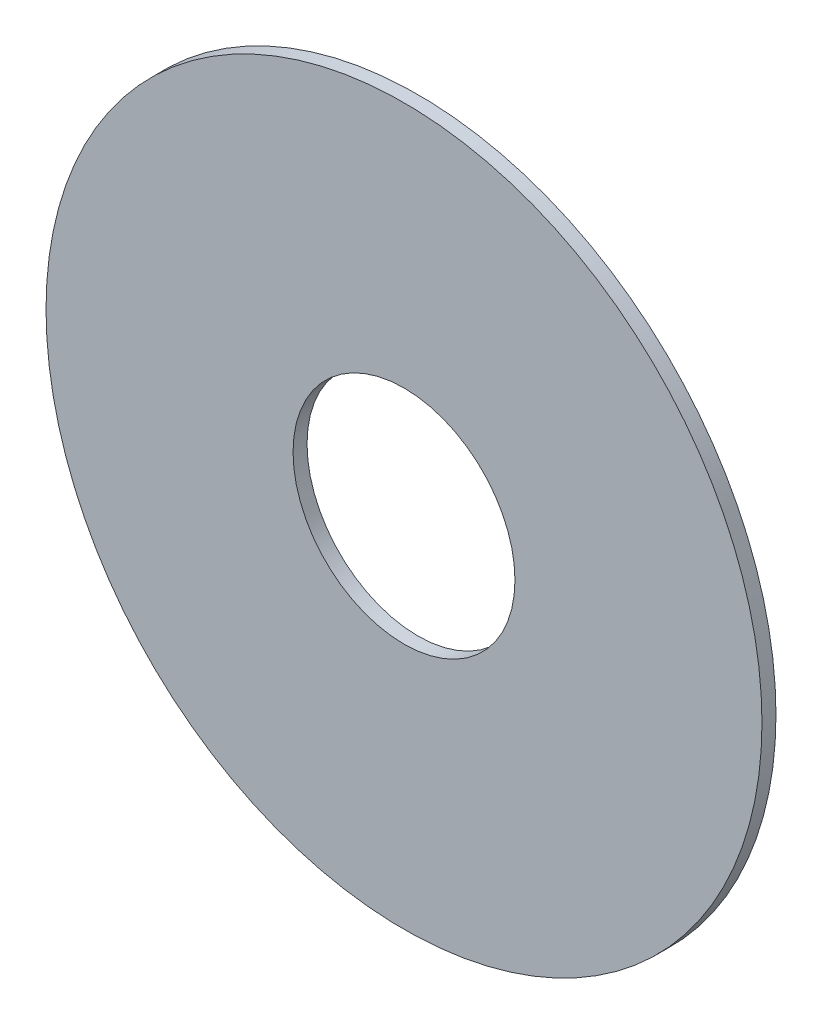
ISO-10303-21;
HEADER;
FILE_DESCRIPTION(('STEP AP214'),'2;1');
FILE_NAME('part.step','',(''),(''),'','','');
FILE_SCHEMA(('AUTOMOTIVE_DESIGN { 1 0 10303 214 1 1 1 1 }'));
ENDSEC;
DATA;
#1=APPLICATION_CONTEXT('core data for automotive mechanical design processes');
#2=APPLICATION_PROTOCOL_DEFINITION('international standard','automotive_design',2000,#1);
#3=PRODUCT_CONTEXT('',#1,'mechanical');
#4=PRODUCT('Part','Part','',(#3));
#5=PRODUCT_RELATED_PRODUCT_CATEGORY('part','',(#4));
#6=PRODUCT_DEFINITION_FORMATION('','',#4);
#7=PRODUCT_DEFINITION_CONTEXT('part definition',#1,'design');
#8=PRODUCT_DEFINITION('design','',#6,#7);
#9=PRODUCT_DEFINITION_SHAPE('','',#8);
#10=(LENGTH_UNIT() NAMED_UNIT(*) SI_UNIT(.MILLI.,.METRE.));
#11=(NAMED_UNIT(*) PLANE_ANGLE_UNIT() SI_UNIT($,.RADIAN.));
#12=(NAMED_UNIT(*) SI_UNIT($,.STERADIAN.) SOLID_ANGLE_UNIT());
#13=UNCERTAINTY_MEASURE_WITH_UNIT(LENGTH_MEASURE(1.E-05),#10,'distance_accuracy_value','');
#14=(GEOMETRIC_REPRESENTATION_CONTEXT(3) GLOBAL_UNCERTAINTY_ASSIGNED_CONTEXT((#13)) GLOBAL_UNIT_ASSIGNED_CONTEXT((#10,
#11,#12)) REPRESENTATION_CONTEXT('',''));
#15=CARTESIAN_POINT('',(0.,0.,0.));
#16=DIRECTION('',(0.,0.,1.));
#17=DIRECTION('',(1.,0.,0.));
#18=AXIS2_PLACEMENT_3D('',#15,#16,#17);
#19=CARTESIAN_POINT('',(1.022079,-20.958697,0.01));
#20=DIRECTION('',(0.,0.,1.));
#21=DIRECTION('',(1.,0.,0.));
#22=AXIS2_PLACEMENT_3D('',#19,#20,#21);
#23=PLANE('',#22);
#24=CARTESIAN_POINT('',(1.022079,-20.958697,0.01));
#25=DIRECTION('',(0.,0.,1.));
#26=DIRECTION('',(1.,0.,0.));
#27=AXIS2_PLACEMENT_3D('',#24,#25,#26);
#28=CIRCLE('',#27,0.079262);
#29=CARTESIAN_POINT('',(0.942817,-20.958697,0.01));
#30=VERTEX_POINT('',#29);
#31=EDGE_CURVE('E64',#30,#30,#28,.T.);
#32=ORIENTED_EDGE('',*,*,#31,.F.);
#33=EDGE_LOOP('',(#32));
#34=FACE_BOUND('',#33,.T.);
#35=CARTESIAN_POINT('',(1.022079,-20.958697,0.01));
#36=DIRECTION('',(0.,0.,1.));
#37=DIRECTION('',(1.,0.,0.));
#38=AXIS2_PLACEMENT_3D('',#35,#36,#37);
#39=CIRCLE('',#38,0.255747);
#40=CARTESIAN_POINT('',(0.766332,-20.958697,0.01));
#41=VERTEX_POINT('',#40);
#42=EDGE_CURVE('E57',#41,#41,#39,.T.);
#43=ORIENTED_EDGE('',*,*,#42,.T.);
#44=EDGE_LOOP('',(#43));
#45=FACE_BOUND('',#44,.T.);
#46=ADVANCED_FACE('F17',(#34,#45),#23,.T.);
#47=CARTESIAN_POINT('',(1.022079,-20.958697,0.));
#48=DIRECTION('',(0.,0.,1.));
#49=DIRECTION('',(1.,0.,0.));
#50=AXIS2_PLACEMENT_3D('',#47,#48,#49);
#51=PLANE('',#50);
#52=CARTESIAN_POINT('',(1.022079,-20.958697,0.));
#53=DIRECTION('',(0.,0.,1.));
#54=DIRECTION('',(1.,0.,0.));
#55=AXIS2_PLACEMENT_3D('',#52,#53,#54);
#56=CIRCLE('',#55,0.079262);
#57=CARTESIAN_POINT('',(0.942817,-20.958697,0.));
#58=VERTEX_POINT('',#57);
#59=EDGE_CURVE('E11',#58,#58,#56,.T.);
#60=ORIENTED_EDGE('',*,*,#59,.T.);
#61=EDGE_LOOP('',(#60));
#62=FACE_BOUND('',#61,.T.);
#63=CARTESIAN_POINT('',(1.022079,-20.958697,0.));
#64=DIRECTION('',(0.,0.,1.));
#65=DIRECTION('',(1.,0.,0.));
#66=AXIS2_PLACEMENT_3D('',#63,#64,#65);
#67=CIRCLE('',#66,0.255747);
#68=CARTESIAN_POINT('',(0.766332,-20.958697,0.));
#69=VERTEX_POINT('',#68);
#70=EDGE_CURVE('E56',#69,#69,#67,.T.);
#71=ORIENTED_EDGE('',*,*,#70,.F.);
#72=EDGE_LOOP('',(#71));
#73=FACE_BOUND('',#72,.T.);
#74=ADVANCED_FACE('F75',(#62,#73),#51,.F.);
#75=CARTESIAN_POINT('',(1.022079,-20.958697,0.));
#76=DIRECTION('',(0.,0.,-1.));
#77=DIRECTION('',(1.,0.,0.));
#78=AXIS2_PLACEMENT_3D('',#75,#76,#77);
#79=CYLINDRICAL_SURFACE('',#78,0.079262);
#80=ORIENTED_EDGE('',*,*,#31,.T.);
#81=DIRECTION('',(0.,0.,-1.));
#82=VECTOR('',#81,1.);
#83=CARTESIAN_POINT('',(0.942817,-20.958697,0.));
#84=LINE('',#83,#82);
#85=EDGE_CURVE('E25',#30,#58,#84,.T.);
#86=ORIENTED_EDGE('',*,*,#85,.T.);
#87=ORIENTED_EDGE('',*,*,#59,.F.);
#88=ORIENTED_EDGE('',*,*,#85,.F.);
#89=EDGE_LOOP('',(#80,#86,#87,#88));
#90=FACE_BOUND('',#89,.T.);
#91=ADVANCED_FACE('F70',(#90),#79,.F.);
#92=CARTESIAN_POINT('',(1.022079,-20.958697,0.));
#93=DIRECTION('',(0.,0.,-1.));
#94=DIRECTION('',(1.,0.,0.));
#95=AXIS2_PLACEMENT_3D('',#92,#93,#94);
#96=CYLINDRICAL_SURFACE('',#95,0.255747);
#97=ORIENTED_EDGE('',*,*,#70,.T.);
#98=DIRECTION('',(0.,0.,1.));
#99=VECTOR('',#98,1.);
#100=CARTESIAN_POINT('',(0.766332,-20.958697,0.));
#101=LINE('',#100,#99);
#102=EDGE_CURVE('E53',#69,#41,#101,.T.);
#103=ORIENTED_EDGE('',*,*,#102,.T.);
#104=ORIENTED_EDGE('',*,*,#42,.F.);
#105=ORIENTED_EDGE('',*,*,#102,.F.);
#106=EDGE_LOOP('',(#97,#103,#104,#105));
#107=FACE_BOUND('',#106,.T.);
#108=ADVANCED_FACE('F54',(#107),#96,.T.);
#109=CLOSED_SHELL('',(#46,#74,#91,#108));
#110=MANIFOLD_SOLID_BREP('B1',#109);
#111=ADVANCED_BREP_SHAPE_REPRESENTATION('',(#18,#110),#14);
#112=SHAPE_DEFINITION_REPRESENTATION(#9,#111);
ENDSEC;
END-ISO-10303-21;
